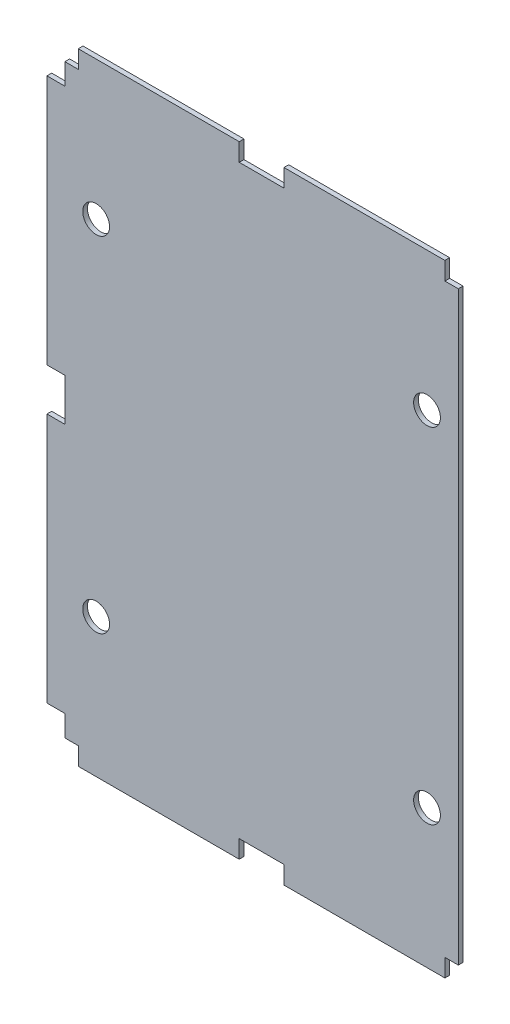
ISO-10303-21;
HEADER;
FILE_DESCRIPTION(('STEP AP214'),'2;1');
FILE_NAME('part.step','',(''),(''),'','','');
FILE_SCHEMA(('AUTOMOTIVE_DESIGN { 1 0 10303 214 1 1 1 1 }'));
ENDSEC;
DATA;
#1=APPLICATION_CONTEXT('core data for automotive mechanical design processes');
#2=APPLICATION_PROTOCOL_DEFINITION('international standard','automotive_design',2000,#1);
#3=PRODUCT_CONTEXT('',#1,'mechanical');
#4=PRODUCT('Part','Part','',(#3));
#5=PRODUCT_RELATED_PRODUCT_CATEGORY('part','',(#4));
#6=PRODUCT_DEFINITION_FORMATION('','',#4);
#7=PRODUCT_DEFINITION_CONTEXT('part definition',#1,'design');
#8=PRODUCT_DEFINITION('design','',#6,#7);
#9=PRODUCT_DEFINITION_SHAPE('','',#8);
#10=(LENGTH_UNIT() NAMED_UNIT(*) SI_UNIT(.MILLI.,.METRE.));
#11=(NAMED_UNIT(*) PLANE_ANGLE_UNIT() SI_UNIT($,.RADIAN.));
#12=(NAMED_UNIT(*) SI_UNIT($,.STERADIAN.) SOLID_ANGLE_UNIT());
#13=UNCERTAINTY_MEASURE_WITH_UNIT(LENGTH_MEASURE(1.E-05),#10,'distance_accuracy_value','');
#14=(GEOMETRIC_REPRESENTATION_CONTEXT(3) GLOBAL_UNCERTAINTY_ASSIGNED_CONTEXT((#13)) GLOBAL_UNIT_ASSIGNED_CONTEXT((#10,
#11,#12)) REPRESENTATION_CONTEXT('',''));
#15=CARTESIAN_POINT('',(0.,0.,0.));
#16=DIRECTION('',(0.,0.,1.));
#17=DIRECTION('',(1.,0.,0.));
#18=AXIS2_PLACEMENT_3D('',#15,#16,#17);
#19=CARTESIAN_POINT('',(0.,-207.9625,3.3528));
#20=DIRECTION('',(0.,1.,0.));
#21=DIRECTION('',(0.,0.,1.));
#22=AXIS2_PLACEMENT_3D('',#19,#20,#21);
#23=PLANE('',#22);
#24=DIRECTION('',(1.,0.,0.));
#25=VECTOR('',#24,1.);
#26=CARTESIAN_POINT('',(0.,-207.9625,0.));
#27=LINE('',#26,#25);
#28=CARTESIAN_POINT('',(-139.7,-207.9625,0.));
#29=VERTEX_POINT('',#28);
#30=CARTESIAN_POINT('',(-130.175,-207.9625,0.));
#31=VERTEX_POINT('',#30);
#32=EDGE_CURVE('E269',#29,#31,#27,.T.);
#33=ORIENTED_EDGE('',*,*,#32,.T.);
#34=DIRECTION('',(0.,0.,-1.));
#35=VECTOR('',#34,1.);
#36=CARTESIAN_POINT('',(-130.175,-207.9625,3.3528));
#37=LINE('',#36,#35);
#38=CARTESIAN_POINT('',(-130.175,-207.9625,3.3528));
#39=VERTEX_POINT('',#38);
#40=EDGE_CURVE('E11',#39,#31,#37,.T.);
#41=ORIENTED_EDGE('',*,*,#40,.F.);
#42=DIRECTION('',(1.,0.,0.));
#43=VECTOR('',#42,1.);
#44=CARTESIAN_POINT('',(0.,-207.9625,3.3528));
#45=LINE('',#44,#43);
#46=CARTESIAN_POINT('',(-139.7,-207.9625,3.3528));
#47=VERTEX_POINT('',#46);
#48=EDGE_CURVE('E414',#47,#39,#45,.T.);
#49=ORIENTED_EDGE('',*,*,#48,.F.);
#50=DIRECTION('',(0.,0.,-1.));
#51=VECTOR('',#50,1.);
#52=CARTESIAN_POINT('',(-139.7,-207.9625,3.3528));
#53=LINE('',#52,#51);
#54=EDGE_CURVE('E52',#47,#29,#53,.T.);
#55=ORIENTED_EDGE('',*,*,#54,.T.);
#56=EDGE_LOOP('',(#33,#41,#49,#55));
#57=FACE_BOUND('',#56,.T.);
#58=ADVANCED_FACE('F35',(#57),#23,.F.);
#59=CARTESIAN_POINT('',(-130.175,0.,3.3528));
#60=DIRECTION('',(1.,0.,0.));
#61=DIRECTION('',(0.,0.,-1.));
#62=AXIS2_PLACEMENT_3D('',#59,#60,#61);
#63=PLANE('',#62);
#64=DIRECTION('',(0.,-1.,0.));
#65=VECTOR('',#64,1.);
#66=CARTESIAN_POINT('',(-130.175,0.,0.));
#67=LINE('',#66,#65);
#68=CARTESIAN_POINT('',(-130.175,-220.6625,0.));
#69=VERTEX_POINT('',#68);
#70=EDGE_CURVE('E271',#31,#69,#67,.T.);
#71=ORIENTED_EDGE('',*,*,#70,.T.);
#72=DIRECTION('',(0.,0.,-1.));
#73=VECTOR('',#72,1.);
#74=CARTESIAN_POINT('',(-130.175,-220.6625,3.3528));
#75=LINE('',#74,#73);
#76=CARTESIAN_POINT('',(-130.175,-220.6625,3.3528));
#77=VERTEX_POINT('',#76);
#78=EDGE_CURVE('E44',#77,#69,#75,.T.);
#79=ORIENTED_EDGE('',*,*,#78,.F.);
#80=DIRECTION('',(0.,-1.,0.));
#81=VECTOR('',#80,1.);
#82=CARTESIAN_POINT('',(-130.175,0.,3.3528));
#83=LINE('',#82,#81);
#84=EDGE_CURVE('E150',#39,#77,#83,.T.);
#85=ORIENTED_EDGE('',*,*,#84,.F.);
#86=ORIENTED_EDGE('',*,*,#40,.T.);
#87=EDGE_LOOP('',(#71,#79,#85,#86));
#88=FACE_BOUND('',#87,.T.);
#89=ADVANCED_FACE('F397',(#88),#63,.F.);
#90=CARTESIAN_POINT('',(0.,-220.6625,3.3528));
#91=DIRECTION('',(0.,-1.,0.));
#92=DIRECTION('',(1.,0.,0.));
#93=AXIS2_PLACEMENT_3D('',#90,#91,#92);
#94=PLANE('',#93);
#95=DIRECTION('',(-1.,0.,0.));
#96=VECTOR('',#95,1.);
#97=CARTESIAN_POINT('',(0.,-220.6625,0.));
#98=LINE('',#97,#96);
#99=CARTESIAN_POINT('',(-15.875,-220.6625,0.));
#100=VERTEX_POINT('',#99);
#101=EDGE_CURVE('E276',#100,#69,#98,.T.);
#102=ORIENTED_EDGE('',*,*,#101,.F.);
#103=DIRECTION('',(0.,0.,-1.));
#104=VECTOR('',#103,1.);
#105=CARTESIAN_POINT('',(-15.875,-220.6625,3.3528));
#106=LINE('',#105,#104);
#107=CARTESIAN_POINT('',(-15.875,-220.6625,3.3528));
#108=VERTEX_POINT('',#107);
#109=EDGE_CURVE('E390',#108,#100,#106,.T.);
#110=ORIENTED_EDGE('',*,*,#109,.F.);
#111=DIRECTION('',(-1.,0.,0.));
#112=VECTOR('',#111,1.);
#113=CARTESIAN_POINT('',(0.,-220.6625,3.3528));
#114=LINE('',#113,#112);
#115=EDGE_CURVE('E396',#108,#77,#114,.T.);
#116=ORIENTED_EDGE('',*,*,#115,.T.);
#117=ORIENTED_EDGE('',*,*,#78,.T.);
#118=EDGE_LOOP('',(#102,#110,#116,#117));
#119=FACE_BOUND('',#118,.T.);
#120=ADVANCED_FACE('F394',(#119),#94,.T.);
#121=CARTESIAN_POINT('',(-15.8750000000001,0.,3.3528));
#122=DIRECTION('',(1.,0.,0.));
#123=DIRECTION('',(0.,1.,0.));
#124=AXIS2_PLACEMENT_3D('',#121,#122,#123);
#125=PLANE('',#124);
#126=DIRECTION('',(0.,-1.,0.));
#127=VECTOR('',#126,1.);
#128=CARTESIAN_POINT('',(-15.8750000000001,0.,0.));
#129=LINE('',#128,#127);
#130=CARTESIAN_POINT('',(-15.875,-207.9625,0.));
#131=VERTEX_POINT('',#130);
#132=EDGE_CURVE('E279',#131,#100,#129,.T.);
#133=ORIENTED_EDGE('',*,*,#132,.F.);
#134=DIRECTION('',(0.,0.,-1.));
#135=VECTOR('',#134,1.);
#136=CARTESIAN_POINT('',(-15.875,-207.9625,3.3528));
#137=LINE('',#136,#135);
#138=CARTESIAN_POINT('',(-15.875,-207.9625,3.3528));
#139=VERTEX_POINT('',#138);
#140=EDGE_CURVE('E388',#139,#131,#137,.T.);
#141=ORIENTED_EDGE('',*,*,#140,.F.);
#142=DIRECTION('',(0.,-1.,0.));
#143=VECTOR('',#142,1.);
#144=CARTESIAN_POINT('',(-15.8750000000001,0.,3.3528));
#145=LINE('',#144,#143);
#146=EDGE_CURVE('E410',#139,#108,#145,.T.);
#147=ORIENTED_EDGE('',*,*,#146,.T.);
#148=ORIENTED_EDGE('',*,*,#109,.T.);
#149=EDGE_LOOP('',(#133,#141,#147,#148));
#150=FACE_BOUND('',#149,.T.);
#151=ADVANCED_FACE('F406',(#150),#125,.T.);
#152=CARTESIAN_POINT('',(15.8750000000005,-207.9625,0.));
#153=VERTEX_POINT('',#152);
#154=EDGE_CURVE('E273',#131,#153,#27,.T.);
#155=ORIENTED_EDGE('',*,*,#154,.T.);
#156=DIRECTION('',(0.,0.,-1.));
#157=VECTOR('',#156,1.);
#158=CARTESIAN_POINT('',(15.8750000000005,-207.9625,3.3528));
#159=LINE('',#158,#157);
#160=CARTESIAN_POINT('',(15.8750000000005,-207.9625,3.3528));
#161=VERTEX_POINT('',#160);
#162=EDGE_CURVE('E385',#161,#153,#159,.T.);
#163=ORIENTED_EDGE('',*,*,#162,.F.);
#164=EDGE_CURVE('E412',#139,#161,#45,.T.);
#165=ORIENTED_EDGE('',*,*,#164,.F.);
#166=ORIENTED_EDGE('',*,*,#140,.T.);
#167=EDGE_LOOP('',(#155,#163,#165,#166));
#168=FACE_BOUND('',#167,.T.);
#169=ADVANCED_FACE('F493',(#168),#23,.F.);
#170=CARTESIAN_POINT('',(15.8750000000005,0.,3.3528));
#171=DIRECTION('',(1.,0.,0.));
#172=DIRECTION('',(0.,0.,-1.));
#173=AXIS2_PLACEMENT_3D('',#170,#171,#172);
#174=PLANE('',#173);
#175=DIRECTION('',(0.,-1.,0.));
#176=VECTOR('',#175,1.);
#177=CARTESIAN_POINT('',(15.8750000000005,0.,0.));
#178=LINE('',#177,#176);
#179=CARTESIAN_POINT('',(15.8750000000005,-220.6625,0.));
#180=VERTEX_POINT('',#179);
#181=EDGE_CURVE('E282',#153,#180,#178,.T.);
#182=ORIENTED_EDGE('',*,*,#181,.T.);
#183=DIRECTION('',(0.,0.,-1.));
#184=VECTOR('',#183,1.);
#185=CARTESIAN_POINT('',(15.8750000000005,-220.6625,3.3528));
#186=LINE('',#185,#184);
#187=CARTESIAN_POINT('',(15.8750000000005,-220.6625,3.3528));
#188=VERTEX_POINT('',#187);
#189=EDGE_CURVE('E383',#188,#180,#186,.T.);
#190=ORIENTED_EDGE('',*,*,#189,.F.);
#191=DIRECTION('',(0.,-1.,0.));
#192=VECTOR('',#191,1.);
#193=CARTESIAN_POINT('',(15.8750000000005,0.,3.3528));
#194=LINE('',#193,#192);
#195=EDGE_CURVE('E418',#161,#188,#194,.T.);
#196=ORIENTED_EDGE('',*,*,#195,.F.);
#197=ORIENTED_EDGE('',*,*,#162,.T.);
#198=EDGE_LOOP('',(#182,#190,#196,#197));
#199=FACE_BOUND('',#198,.T.);
#200=ADVANCED_FACE('F502',(#199),#174,.F.);
#201=CARTESIAN_POINT('',(0.,-220.6625,3.3528));
#202=DIRECTION('',(0.,-1.,0.));
#203=DIRECTION('',(1.,0.,0.));
#204=AXIS2_PLACEMENT_3D('',#201,#202,#203);
#205=PLANE('',#204);
#206=DIRECTION('',(-1.,0.,0.));
#207=VECTOR('',#206,1.);
#208=CARTESIAN_POINT('',(0.,-220.6625,0.));
#209=LINE('',#208,#207);
#210=CARTESIAN_POINT('',(130.175,-220.6625,0.));
#211=VERTEX_POINT('',#210);
#212=EDGE_CURVE('E285',#211,#180,#209,.T.);
#213=ORIENTED_EDGE('',*,*,#212,.F.);
#214=DIRECTION('',(0.,0.,-1.));
#215=VECTOR('',#214,1.);
#216=CARTESIAN_POINT('',(130.175,-220.6625,3.3528));
#217=LINE('',#216,#215);
#218=CARTESIAN_POINT('',(130.175,-220.6625,3.3528));
#219=VERTEX_POINT('',#218);
#220=EDGE_CURVE('E381',#219,#211,#217,.T.);
#221=ORIENTED_EDGE('',*,*,#220,.F.);
#222=DIRECTION('',(-1.,0.,0.));
#223=VECTOR('',#222,1.);
#224=CARTESIAN_POINT('',(0.,-220.6625,3.3528));
#225=LINE('',#224,#223);
#226=EDGE_CURVE('E420',#219,#188,#225,.T.);
#227=ORIENTED_EDGE('',*,*,#226,.T.);
#228=ORIENTED_EDGE('',*,*,#189,.T.);
#229=EDGE_LOOP('',(#213,#221,#227,#228));
#230=FACE_BOUND('',#229,.T.);
#231=ADVANCED_FACE('F514',(#230),#205,.T.);
#232=CARTESIAN_POINT('',(130.175,0.,3.3528));
#233=DIRECTION('',(1.,0.,0.));
#234=DIRECTION('',(0.,0.,-1.));
#235=AXIS2_PLACEMENT_3D('',#232,#233,#234);
#236=PLANE('',#235);
#237=DIRECTION('',(0.,-1.,0.));
#238=VECTOR('',#237,1.);
#239=CARTESIAN_POINT('',(130.175,0.,0.));
#240=LINE('',#239,#238);
#241=CARTESIAN_POINT('',(130.175,-207.9625,0.));
#242=VERTEX_POINT('',#241);
#243=EDGE_CURVE('E288',#242,#211,#240,.T.);
#244=ORIENTED_EDGE('',*,*,#243,.F.);
#245=DIRECTION('',(0.,0.,-1.));
#246=VECTOR('',#245,1.);
#247=CARTESIAN_POINT('',(130.175,-207.9625,3.3528));
#248=LINE('',#247,#246);
#249=CARTESIAN_POINT('',(130.175,-207.9625,3.3528));
#250=VERTEX_POINT('',#249);
#251=EDGE_CURVE('E379',#250,#242,#248,.T.);
#252=ORIENTED_EDGE('',*,*,#251,.F.);
#253=DIRECTION('',(0.,-1.,0.));
#254=VECTOR('',#253,1.);
#255=CARTESIAN_POINT('',(130.175,0.,3.3528));
#256=LINE('',#255,#254);
#257=EDGE_CURVE('E423',#250,#219,#256,.T.);
#258=ORIENTED_EDGE('',*,*,#257,.T.);
#259=ORIENTED_EDGE('',*,*,#220,.T.);
#260=EDGE_LOOP('',(#244,#252,#258,#259));
#261=FACE_BOUND('',#260,.T.);
#262=ADVANCED_FACE('F506',(#261),#236,.T.);
#263=CARTESIAN_POINT('',(139.7,-207.9625,0.));
#264=VERTEX_POINT('',#263);
#265=EDGE_CURVE('E272',#242,#264,#27,.T.);
#266=ORIENTED_EDGE('',*,*,#265,.T.);
#267=DIRECTION('',(0.,0.,-1.));
#268=VECTOR('',#267,1.);
#269=CARTESIAN_POINT('',(139.7,-207.9625,3.3528));
#270=LINE('',#269,#268);
#271=CARTESIAN_POINT('',(139.7,-207.9625,3.3528));
#272=VERTEX_POINT('',#271);
#273=EDGE_CURVE('E376',#272,#264,#270,.T.);
#274=ORIENTED_EDGE('',*,*,#273,.F.);
#275=EDGE_CURVE('E426',#250,#272,#45,.T.);
#276=ORIENTED_EDGE('',*,*,#275,.F.);
#277=ORIENTED_EDGE('',*,*,#251,.T.);
#278=EDGE_LOOP('',(#266,#274,#276,#277));
#279=FACE_BOUND('',#278,.T.);
#280=ADVANCED_FACE('F494',(#279),#23,.F.);
#281=CARTESIAN_POINT('',(139.7,0.,3.3528));
#282=DIRECTION('',(-1.,0.,0.));
#283=DIRECTION('',(0.,0.,1.));
#284=AXIS2_PLACEMENT_3D('',#281,#282,#283);
#285=PLANE('',#284);
#286=DIRECTION('',(0.,1.,0.));
#287=VECTOR('',#286,1.);
#288=CARTESIAN_POINT('',(139.7,0.,0.));
#289=LINE('',#288,#287);
#290=CARTESIAN_POINT('',(139.7,207.9625,0.));
#291=VERTEX_POINT('',#290);
#292=EDGE_CURVE('E291',#264,#291,#289,.T.);
#293=ORIENTED_EDGE('',*,*,#292,.T.);
#294=DIRECTION('',(0.,0.,-1.));
#295=VECTOR('',#294,1.);
#296=CARTESIAN_POINT('',(139.7,207.9625,3.3528));
#297=LINE('',#296,#295);
#298=CARTESIAN_POINT('',(139.7,207.9625,3.3528));
#299=VERTEX_POINT('',#298);
#300=EDGE_CURVE('E374',#299,#291,#297,.T.);
#301=ORIENTED_EDGE('',*,*,#300,.F.);
#302=DIRECTION('',(0.,1.,0.));
#303=VECTOR('',#302,1.);
#304=CARTESIAN_POINT('',(139.7,0.,3.3528));
#305=LINE('',#304,#303);
#306=EDGE_CURVE('E427',#272,#299,#305,.T.);
#307=ORIENTED_EDGE('',*,*,#306,.F.);
#308=ORIENTED_EDGE('',*,*,#273,.T.);
#309=EDGE_LOOP('',(#293,#301,#307,#308));
#310=FACE_BOUND('',#309,.T.);
#311=ADVANCED_FACE('F505',(#310),#285,.F.);
#312=CARTESIAN_POINT('',(0.,207.9625,3.3528));
#313=DIRECTION('',(0.,1.,0.));
#314=DIRECTION('',(0.,0.,1.));
#315=AXIS2_PLACEMENT_3D('',#312,#313,#314);
#316=PLANE('',#315);
#317=DIRECTION('',(1.,0.,0.));
#318=VECTOR('',#317,1.);
#319=CARTESIAN_POINT('',(0.,207.9625,0.));
#320=LINE('',#319,#318);
#321=CARTESIAN_POINT('',(130.175,207.9625,0.));
#322=VERTEX_POINT('',#321);
#323=EDGE_CURVE('E294',#322,#291,#320,.T.);
#324=ORIENTED_EDGE('',*,*,#323,.F.);
#325=DIRECTION('',(0.,0.,-1.));
#326=VECTOR('',#325,1.);
#327=CARTESIAN_POINT('',(130.175,207.9625,3.3528));
#328=LINE('',#327,#326);
#329=CARTESIAN_POINT('',(130.175,207.9625,3.3528));
#330=VERTEX_POINT('',#329);
#331=EDGE_CURVE('E372',#330,#322,#328,.T.);
#332=ORIENTED_EDGE('',*,*,#331,.F.);
#333=DIRECTION('',(1.,0.,0.));
#334=VECTOR('',#333,1.);
#335=CARTESIAN_POINT('',(0.,207.9625,3.3528));
#336=LINE('',#335,#334);
#337=EDGE_CURVE('E429',#330,#299,#336,.T.);
#338=ORIENTED_EDGE('',*,*,#337,.T.);
#339=ORIENTED_EDGE('',*,*,#300,.T.);
#340=EDGE_LOOP('',(#324,#332,#338,#339));
#341=FACE_BOUND('',#340,.T.);
#342=ADVANCED_FACE('F512',(#341),#316,.T.);
#343=CARTESIAN_POINT('',(130.175,0.,3.3528));
#344=DIRECTION('',(-1.,0.,0.));
#345=DIRECTION('',(0.,0.,1.));
#346=AXIS2_PLACEMENT_3D('',#343,#344,#345);
#347=PLANE('',#346);
#348=DIRECTION('',(0.,1.,0.));
#349=VECTOR('',#348,1.);
#350=CARTESIAN_POINT('',(130.175,0.,0.));
#351=LINE('',#350,#349);
#352=CARTESIAN_POINT('',(130.175,220.6625,0.));
#353=VERTEX_POINT('',#352);
#354=EDGE_CURVE('E297',#322,#353,#351,.T.);
#355=ORIENTED_EDGE('',*,*,#354,.T.);
#356=DIRECTION('',(0.,0.,-1.));
#357=VECTOR('',#356,1.);
#358=CARTESIAN_POINT('',(130.175,220.6625,3.3528));
#359=LINE('',#358,#357);
#360=CARTESIAN_POINT('',(130.175,220.6625,3.3528));
#361=VERTEX_POINT('',#360);
#362=EDGE_CURVE('E370',#361,#353,#359,.T.);
#363=ORIENTED_EDGE('',*,*,#362,.F.);
#364=DIRECTION('',(0.,1.,0.));
#365=VECTOR('',#364,1.);
#366=CARTESIAN_POINT('',(130.175,0.,3.3528));
#367=LINE('',#366,#365);
#368=EDGE_CURVE('E432',#330,#361,#367,.T.);
#369=ORIENTED_EDGE('',*,*,#368,.F.);
#370=ORIENTED_EDGE('',*,*,#331,.T.);
#371=EDGE_LOOP('',(#355,#363,#369,#370));
#372=FACE_BOUND('',#371,.T.);
#373=ADVANCED_FACE('F776',(#372),#347,.F.);
#374=CARTESIAN_POINT('',(0.,220.6625,3.3528));
#375=DIRECTION('',(0.,1.,0.));
#376=DIRECTION('',(0.,0.,1.));
#377=AXIS2_PLACEMENT_3D('',#374,#375,#376);
#378=PLANE('',#377);
#379=DIRECTION('',(1.,0.,0.));
#380=VECTOR('',#379,1.);
#381=CARTESIAN_POINT('',(0.,220.6625,0.));
#382=LINE('',#381,#380);
#383=CARTESIAN_POINT('',(15.8750000000001,220.6625,0.));
#384=VERTEX_POINT('',#383);
#385=EDGE_CURVE('E302',#384,#353,#382,.T.);
#386=ORIENTED_EDGE('',*,*,#385,.F.);
#387=DIRECTION('',(0.,0.,-1.));
#388=VECTOR('',#387,1.);
#389=CARTESIAN_POINT('',(15.8750000000001,220.6625,3.3528));
#390=LINE('',#389,#388);
#391=CARTESIAN_POINT('',(15.8750000000001,220.6625,3.3528));
#392=VERTEX_POINT('',#391);
#393=EDGE_CURVE('E368',#392,#384,#390,.T.);
#394=ORIENTED_EDGE('',*,*,#393,.F.);
#395=DIRECTION('',(1.,0.,0.));
#396=VECTOR('',#395,1.);
#397=CARTESIAN_POINT('',(0.,220.6625,3.3528));
#398=LINE('',#397,#396);
#399=EDGE_CURVE('E436',#392,#361,#398,.T.);
#400=ORIENTED_EDGE('',*,*,#399,.T.);
#401=ORIENTED_EDGE('',*,*,#362,.T.);
#402=EDGE_LOOP('',(#386,#394,#400,#401));
#403=FACE_BOUND('',#402,.T.);
#404=ADVANCED_FACE('F765',(#403),#378,.T.);
#405=CARTESIAN_POINT('',(15.8750000000001,0.,3.3528));
#406=DIRECTION('',(-1.,0.,0.));
#407=DIRECTION('',(0.,0.,1.));
#408=AXIS2_PLACEMENT_3D('',#405,#406,#407);
#409=PLANE('',#408);
#410=DIRECTION('',(0.,1.,0.));
#411=VECTOR('',#410,1.);
#412=CARTESIAN_POINT('',(15.8750000000001,0.,0.));
#413=LINE('',#412,#411);
#414=CARTESIAN_POINT('',(15.8750000000001,207.9625,0.));
#415=VERTEX_POINT('',#414);
#416=EDGE_CURVE('E305',#415,#384,#413,.T.);
#417=ORIENTED_EDGE('',*,*,#416,.F.);
#418=DIRECTION('',(0.,0.,-1.));
#419=VECTOR('',#418,1.);
#420=CARTESIAN_POINT('',(15.8750000000001,207.9625,3.3528));
#421=LINE('',#420,#419);
#422=CARTESIAN_POINT('',(15.8750000000001,207.9625,3.3528));
#423=VERTEX_POINT('',#422);
#424=EDGE_CURVE('E366',#423,#415,#421,.T.);
#425=ORIENTED_EDGE('',*,*,#424,.F.);
#426=DIRECTION('',(0.,1.,0.));
#427=VECTOR('',#426,1.);
#428=CARTESIAN_POINT('',(15.8750000000001,0.,3.3528));
#429=LINE('',#428,#427);
#430=EDGE_CURVE('E439',#423,#392,#429,.T.);
#431=ORIENTED_EDGE('',*,*,#430,.T.);
#432=ORIENTED_EDGE('',*,*,#393,.T.);
#433=EDGE_LOOP('',(#417,#425,#431,#432));
#434=FACE_BOUND('',#433,.T.);
#435=ADVANCED_FACE('F755',(#434),#409,.T.);
#436=CARTESIAN_POINT('',(-15.875,207.9625,0.));
#437=VERTEX_POINT('',#436);
#438=EDGE_CURVE('E299',#437,#415,#320,.T.);
#439=ORIENTED_EDGE('',*,*,#438,.F.);
#440=DIRECTION('',(0.,0.,-1.));
#441=VECTOR('',#440,1.);
#442=CARTESIAN_POINT('',(-15.875,207.9625,3.3528));
#443=LINE('',#442,#441);
#444=CARTESIAN_POINT('',(-15.875,207.9625,3.3528));
#445=VERTEX_POINT('',#444);
#446=EDGE_CURVE('E364',#445,#437,#443,.T.);
#447=ORIENTED_EDGE('',*,*,#446,.F.);
#448=EDGE_CURVE('E434',#445,#423,#336,.T.);
#449=ORIENTED_EDGE('',*,*,#448,.T.);
#450=ORIENTED_EDGE('',*,*,#424,.T.);
#451=EDGE_LOOP('',(#439,#447,#449,#450));
#452=FACE_BOUND('',#451,.T.);
#453=ADVANCED_FACE('F715',(#452),#316,.T.);
#454=CARTESIAN_POINT('',(-15.875,0.,3.3528));
#455=DIRECTION('',(-1.,0.,0.));
#456=DIRECTION('',(0.,0.,1.));
#457=AXIS2_PLACEMENT_3D('',#454,#455,#456);
#458=PLANE('',#457);
#459=DIRECTION('',(0.,1.,0.));
#460=VECTOR('',#459,1.);
#461=CARTESIAN_POINT('',(-15.875,0.,0.));
#462=LINE('',#461,#460);
#463=CARTESIAN_POINT('',(-15.875,220.6625,0.));
#464=VERTEX_POINT('',#463);
#465=EDGE_CURVE('E308',#437,#464,#462,.T.);
#466=ORIENTED_EDGE('',*,*,#465,.T.);
#467=DIRECTION('',(0.,0.,-1.));
#468=VECTOR('',#467,1.);
#469=CARTESIAN_POINT('',(-15.875,220.6625,3.3528));
#470=LINE('',#469,#468);
#471=CARTESIAN_POINT('',(-15.875,220.6625,3.3528));
#472=VERTEX_POINT('',#471);
#473=EDGE_CURVE('E362',#472,#464,#470,.T.);
#474=ORIENTED_EDGE('',*,*,#473,.F.);
#475=DIRECTION('',(0.,1.,0.));
#476=VECTOR('',#475,1.);
#477=CARTESIAN_POINT('',(-15.875,0.,3.3528));
#478=LINE('',#477,#476);
#479=EDGE_CURVE('E442',#445,#472,#478,.T.);
#480=ORIENTED_EDGE('',*,*,#479,.F.);
#481=ORIENTED_EDGE('',*,*,#446,.T.);
#482=EDGE_LOOP('',(#466,#474,#480,#481));
#483=FACE_BOUND('',#482,.T.);
#484=ADVANCED_FACE('F736',(#483),#458,.F.);
#485=CARTESIAN_POINT('',(0.,220.6625,3.3528));
#486=DIRECTION('',(0.,1.,0.));
#487=DIRECTION('',(0.,0.,1.));
#488=AXIS2_PLACEMENT_3D('',#485,#486,#487);
#489=PLANE('',#488);
#490=DIRECTION('',(1.,0.,0.));
#491=VECTOR('',#490,1.);
#492=CARTESIAN_POINT('',(0.,220.6625,0.));
#493=LINE('',#492,#491);
#494=CARTESIAN_POINT('',(-130.175,220.6625,0.));
#495=VERTEX_POINT('',#494);
#496=EDGE_CURVE('E311',#495,#464,#493,.T.);
#497=ORIENTED_EDGE('',*,*,#496,.F.);
#498=DIRECTION('',(0.,0.,-1.));
#499=VECTOR('',#498,1.);
#500=CARTESIAN_POINT('',(-130.175,220.6625,3.3528));
#501=LINE('',#500,#499);
#502=CARTESIAN_POINT('',(-130.175,220.6625,3.3528));
#503=VERTEX_POINT('',#502);
#504=EDGE_CURVE('E360',#503,#495,#501,.T.);
#505=ORIENTED_EDGE('',*,*,#504,.F.);
#506=DIRECTION('',(1.,0.,0.));
#507=VECTOR('',#506,1.);
#508=CARTESIAN_POINT('',(0.,220.6625,3.3528));
#509=LINE('',#508,#507);
#510=EDGE_CURVE('E444',#503,#472,#509,.T.);
#511=ORIENTED_EDGE('',*,*,#510,.T.);
#512=ORIENTED_EDGE('',*,*,#473,.T.);
#513=EDGE_LOOP('',(#497,#505,#511,#512));
#514=FACE_BOUND('',#513,.T.);
#515=ADVANCED_FACE('F725',(#514),#489,.T.);
#516=CARTESIAN_POINT('',(-130.175,0.,3.3528));
#517=DIRECTION('',(-1.,0.,0.));
#518=DIRECTION('',(0.,0.,1.));
#519=AXIS2_PLACEMENT_3D('',#516,#517,#518);
#520=PLANE('',#519);
#521=DIRECTION('',(0.,1.,0.));
#522=VECTOR('',#521,1.);
#523=CARTESIAN_POINT('',(-130.175,0.,0.));
#524=LINE('',#523,#522);
#525=CARTESIAN_POINT('',(-130.175,207.9625,0.));
#526=VERTEX_POINT('',#525);
#527=EDGE_CURVE('E314',#526,#495,#524,.T.);
#528=ORIENTED_EDGE('',*,*,#527,.F.);
#529=DIRECTION('',(0.,0.,-1.));
#530=VECTOR('',#529,1.);
#531=CARTESIAN_POINT('',(-130.175,207.9625,3.3528));
#532=LINE('',#531,#530);
#533=CARTESIAN_POINT('',(-130.175,207.9625,3.3528));
#534=VERTEX_POINT('',#533);
#535=EDGE_CURVE('E358',#534,#526,#532,.T.);
#536=ORIENTED_EDGE('',*,*,#535,.F.);
#537=DIRECTION('',(0.,1.,0.));
#538=VECTOR('',#537,1.);
#539=CARTESIAN_POINT('',(-130.175,0.,3.3528));
#540=LINE('',#539,#538);
#541=EDGE_CURVE('E447',#534,#503,#540,.T.);
#542=ORIENTED_EDGE('',*,*,#541,.T.);
#543=ORIENTED_EDGE('',*,*,#504,.T.);
#544=EDGE_LOOP('',(#528,#536,#542,#543));
#545=FACE_BOUND('',#544,.T.);
#546=ADVANCED_FACE('F712',(#545),#520,.T.);
#547=CARTESIAN_POINT('',(-139.7,207.9625,0.));
#548=VERTEX_POINT('',#547);
#549=EDGE_CURVE('E298',#548,#526,#320,.T.);
#550=ORIENTED_EDGE('',*,*,#549,.F.);
#551=DIRECTION('',(0.,0.,-1.));
#552=VECTOR('',#551,1.);
#553=CARTESIAN_POINT('',(-139.7,207.9625,3.3528));
#554=LINE('',#553,#552);
#555=CARTESIAN_POINT('',(-139.7,207.9625,3.3528));
#556=VERTEX_POINT('',#555);
#557=EDGE_CURVE('E356',#556,#548,#554,.T.);
#558=ORIENTED_EDGE('',*,*,#557,.F.);
#559=EDGE_CURVE('E433',#556,#534,#336,.T.);
#560=ORIENTED_EDGE('',*,*,#559,.T.);
#561=ORIENTED_EDGE('',*,*,#535,.T.);
#562=EDGE_LOOP('',(#550,#558,#560,#561));
#563=FACE_BOUND('',#562,.T.);
#564=ADVANCED_FACE('F487',(#563),#316,.T.);
#565=CARTESIAN_POINT('',(-139.7,0.,3.3528));
#566=DIRECTION('',(-1.,0.,0.));
#567=DIRECTION('',(0.,0.,1.));
#568=AXIS2_PLACEMENT_3D('',#565,#566,#567);
#569=PLANE('',#568);
#570=DIRECTION('',(0.,1.,0.));
#571=VECTOR('',#570,1.);
#572=CARTESIAN_POINT('',(-139.7,0.,0.));
#573=LINE('',#572,#571);
#574=CARTESIAN_POINT('',(-139.7,192.88125,0.));
#575=VERTEX_POINT('',#574);
#576=EDGE_CURVE('E317',#575,#548,#573,.T.);
#577=ORIENTED_EDGE('',*,*,#576,.F.);
#578=DIRECTION('',(0.,0.,-1.));
#579=VECTOR('',#578,1.);
#580=CARTESIAN_POINT('',(-139.7,192.88125,3.3528));
#581=LINE('',#580,#579);
#582=CARTESIAN_POINT('',(-139.7,192.88125,3.3528));
#583=VERTEX_POINT('',#582);
#584=EDGE_CURVE('E354',#583,#575,#581,.T.);
#585=ORIENTED_EDGE('',*,*,#584,.F.);
#586=DIRECTION('',(0.,1.,0.));
#587=VECTOR('',#586,1.);
#588=CARTESIAN_POINT('',(-139.7,0.,3.3528));
#589=LINE('',#588,#587);
#590=EDGE_CURVE('E255',#583,#556,#589,.T.);
#591=ORIENTED_EDGE('',*,*,#590,.T.);
#592=ORIENTED_EDGE('',*,*,#557,.T.);
#593=EDGE_LOOP('',(#577,#585,#591,#592));
#594=FACE_BOUND('',#593,.T.);
#595=ADVANCED_FACE('F476',(#594),#569,.T.);
#596=CARTESIAN_POINT('',(0.,192.88125,3.3528));
#597=DIRECTION('',(0.,-1.,0.));
#598=DIRECTION('',(0.,0.,-1.));
#599=AXIS2_PLACEMENT_3D('',#596,#597,#598);
#600=PLANE('',#599);
#601=DIRECTION('',(-1.,0.,0.));
#602=VECTOR('',#601,1.);
#603=CARTESIAN_POINT('',(0.,192.88125,0.));
#604=LINE('',#603,#602);
#605=CARTESIAN_POINT('',(-152.4,192.88125,0.));
#606=VERTEX_POINT('',#605);
#607=EDGE_CURVE('E320',#575,#606,#604,.T.);
#608=ORIENTED_EDGE('',*,*,#607,.T.);
#609=DIRECTION('',(0.,0.,-1.));
#610=VECTOR('',#609,1.);
#611=CARTESIAN_POINT('',(-152.4,192.88125,3.3528));
#612=LINE('',#611,#610);
#613=CARTESIAN_POINT('',(-152.4,192.88125,3.3528));
#614=VERTEX_POINT('',#613);
#615=EDGE_CURVE('E351',#614,#606,#612,.T.);
#616=ORIENTED_EDGE('',*,*,#615,.F.);
#617=DIRECTION('',(-1.,0.,0.));
#618=VECTOR('',#617,1.);
#619=CARTESIAN_POINT('',(0.,192.88125,3.3528));
#620=LINE('',#619,#618);
#621=EDGE_CURVE('E451',#583,#614,#620,.T.);
#622=ORIENTED_EDGE('',*,*,#621,.F.);
#623=ORIENTED_EDGE('',*,*,#584,.T.);
#624=EDGE_LOOP('',(#608,#616,#622,#623));
#625=FACE_BOUND('',#624,.T.);
#626=ADVANCED_FACE('F486',(#625),#600,.F.);
#627=CARTESIAN_POINT('',(-152.4,0.,3.3528));
#628=DIRECTION('',(1.,0.,0.));
#629=DIRECTION('',(0.,1.,0.));
#630=AXIS2_PLACEMENT_3D('',#627,#628,#629);
#631=PLANE('',#630);
#632=DIRECTION('',(0.,-1.,0.));
#633=VECTOR('',#632,1.);
#634=CARTESIAN_POINT('',(-152.4,0.,0.));
#635=LINE('',#634,#633);
#636=CARTESIAN_POINT('',(-152.4,15.08125,0.));
#637=VERTEX_POINT('',#636);
#638=EDGE_CURVE('E324',#606,#637,#635,.T.);
#639=ORIENTED_EDGE('',*,*,#638,.T.);
#640=DIRECTION('',(0.,0.,-1.));
#641=VECTOR('',#640,1.);
#642=CARTESIAN_POINT('',(-152.4,15.08125,3.3528));
#643=LINE('',#642,#641);
#644=CARTESIAN_POINT('',(-152.4,15.08125,3.3528));
#645=VERTEX_POINT('',#644);
#646=EDGE_CURVE('E349',#645,#637,#643,.T.);
#647=ORIENTED_EDGE('',*,*,#646,.F.);
#648=DIRECTION('',(0.,-1.,0.));
#649=VECTOR('',#648,1.);
#650=CARTESIAN_POINT('',(-152.4,0.,3.3528));
#651=LINE('',#650,#649);
#652=EDGE_CURVE('E453',#614,#645,#651,.T.);
#653=ORIENTED_EDGE('',*,*,#652,.F.);
#654=ORIENTED_EDGE('',*,*,#615,.T.);
#655=EDGE_LOOP('',(#639,#647,#653,#654));
#656=FACE_BOUND('',#655,.T.);
#657=ADVANCED_FACE('F677',(#656),#631,.F.);
#658=CARTESIAN_POINT('',(0.,15.08125,3.3528));
#659=DIRECTION('',(0.,-1.,0.));
#660=DIRECTION('',(1.,0.,0.));
#661=AXIS2_PLACEMENT_3D('',#658,#659,#660);
#662=PLANE('',#661);
#663=DIRECTION('',(-1.,0.,0.));
#664=VECTOR('',#663,1.);
#665=CARTESIAN_POINT('',(0.,15.08125,0.));
#666=LINE('',#665,#664);
#667=CARTESIAN_POINT('',(-139.7,15.08125,0.));
#668=VERTEX_POINT('',#667);
#669=EDGE_CURVE('E327',#668,#637,#666,.T.);
#670=ORIENTED_EDGE('',*,*,#669,.F.);
#671=DIRECTION('',(0.,0.,-1.));
#672=VECTOR('',#671,1.);
#673=CARTESIAN_POINT('',(-139.7,15.08125,3.3528));
#674=LINE('',#673,#672);
#675=CARTESIAN_POINT('',(-139.7,15.08125,3.3528));
#676=VERTEX_POINT('',#675);
#677=EDGE_CURVE('E347',#676,#668,#674,.T.);
#678=ORIENTED_EDGE('',*,*,#677,.F.);
#679=DIRECTION('',(-1.,0.,0.));
#680=VECTOR('',#679,1.);
#681=CARTESIAN_POINT('',(0.,15.08125,3.3528));
#682=LINE('',#681,#680);
#683=EDGE_CURVE('E455',#676,#645,#682,.T.);
#684=ORIENTED_EDGE('',*,*,#683,.T.);
#685=ORIENTED_EDGE('',*,*,#646,.T.);
#686=EDGE_LOOP('',(#670,#678,#684,#685));
#687=FACE_BOUND('',#686,.T.);
#688=ADVANCED_FACE('F466',(#687),#662,.T.);
#689=CARTESIAN_POINT('',(-139.7,-15.08125,0.));
#690=VERTEX_POINT('',#689);
#691=EDGE_CURVE('E322',#690,#668,#573,.T.);
#692=ORIENTED_EDGE('',*,*,#691,.F.);
#693=DIRECTION('',(0.,0.,-1.));
#694=VECTOR('',#693,1.);
#695=CARTESIAN_POINT('',(-139.7,-15.08125,3.3528));
#696=LINE('',#695,#694);
#697=CARTESIAN_POINT('',(-139.7,-15.08125,3.3528));
#698=VERTEX_POINT('',#697);
#699=EDGE_CURVE('E345',#698,#690,#696,.T.);
#700=ORIENTED_EDGE('',*,*,#699,.F.);
#701=EDGE_CURVE('E254',#698,#676,#589,.T.);
#702=ORIENTED_EDGE('',*,*,#701,.T.);
#703=ORIENTED_EDGE('',*,*,#677,.T.);
#704=EDGE_LOOP('',(#692,#700,#702,#703));
#705=FACE_BOUND('',#704,.T.);
#706=ADVANCED_FACE('F460',(#705),#569,.T.);
#707=CARTESIAN_POINT('',(0.,-15.08125,3.3528));
#708=DIRECTION('',(0.,-1.,0.));
#709=DIRECTION('',(1.,0.,0.));
#710=AXIS2_PLACEMENT_3D('',#707,#708,#709);
#711=PLANE('',#710);
#712=DIRECTION('',(-1.,0.,0.));
#713=VECTOR('',#712,1.);
#714=CARTESIAN_POINT('',(0.,-15.08125,0.));
#715=LINE('',#714,#713);
#716=CARTESIAN_POINT('',(-152.4,-15.08125,0.));
#717=VERTEX_POINT('',#716);
#718=EDGE_CURVE('E330',#690,#717,#715,.T.);
#719=ORIENTED_EDGE('',*,*,#718,.T.);
#720=DIRECTION('',(0.,0.,-1.));
#721=VECTOR('',#720,1.);
#722=CARTESIAN_POINT('',(-152.4,-15.08125,3.3528));
#723=LINE('',#722,#721);
#724=CARTESIAN_POINT('',(-152.4,-15.08125,3.3528));
#725=VERTEX_POINT('',#724);
#726=EDGE_CURVE('E247',#725,#717,#723,.T.);
#727=ORIENTED_EDGE('',*,*,#726,.F.);
#728=DIRECTION('',(-1.,0.,0.));
#729=VECTOR('',#728,1.);
#730=CARTESIAN_POINT('',(0.,-15.08125,3.3528));
#731=LINE('',#730,#729);
#732=EDGE_CURVE('E235',#698,#725,#731,.T.);
#733=ORIENTED_EDGE('',*,*,#732,.F.);
#734=ORIENTED_EDGE('',*,*,#699,.T.);
#735=EDGE_LOOP('',(#719,#727,#733,#734));
#736=FACE_BOUND('',#735,.T.);
#737=ADVANCED_FACE('F490',(#736),#711,.F.);
#738=CARTESIAN_POINT('',(-152.4,0.,3.3528));
#739=DIRECTION('',(1.,0.,0.));
#740=DIRECTION('',(0.,1.,0.));
#741=AXIS2_PLACEMENT_3D('',#738,#739,#740);
#742=PLANE('',#741);
#743=DIRECTION('',(0.,-1.,0.));
#744=VECTOR('',#743,1.);
#745=CARTESIAN_POINT('',(-152.4,0.,0.));
#746=LINE('',#745,#744);
#747=CARTESIAN_POINT('',(-152.4,-192.88125,0.));
#748=VERTEX_POINT('',#747);
#749=EDGE_CURVE('E244',#717,#748,#746,.T.);
#750=ORIENTED_EDGE('',*,*,#749,.T.);
#751=DIRECTION('',(0.,0.,-1.));
#752=VECTOR('',#751,1.);
#753=CARTESIAN_POINT('',(-152.4,-192.88125,3.3528));
#754=LINE('',#753,#752);
#755=CARTESIAN_POINT('',(-152.4,-192.88125,3.3528));
#756=VERTEX_POINT('',#755);
#757=EDGE_CURVE('E241',#756,#748,#754,.T.);
#758=ORIENTED_EDGE('',*,*,#757,.F.);
#759=DIRECTION('',(0.,-1.,0.));
#760=VECTOR('',#759,1.);
#761=CARTESIAN_POINT('',(-152.4,0.,3.3528));
#762=LINE('',#761,#760);
#763=EDGE_CURVE('E226',#725,#756,#762,.T.);
#764=ORIENTED_EDGE('',*,*,#763,.F.);
#765=ORIENTED_EDGE('',*,*,#726,.T.);
#766=EDGE_LOOP('',(#750,#758,#764,#765));
#767=FACE_BOUND('',#766,.T.);
#768=ADVANCED_FACE('F242',(#767),#742,.F.);
#769=CARTESIAN_POINT('',(0.,-192.88125,3.3528));
#770=DIRECTION('',(0.,-1.,0.));
#771=DIRECTION('',(0.,0.,-1.));
#772=AXIS2_PLACEMENT_3D('',#769,#770,#771);
#773=PLANE('',#772);
#774=DIRECTION('',(-1.,0.,0.));
#775=VECTOR('',#774,1.);
#776=CARTESIAN_POINT('',(0.,-192.88125,0.));
#777=LINE('',#776,#775);
#778=CARTESIAN_POINT('',(-139.7,-192.88125,0.));
#779=VERTEX_POINT('',#778);
#780=EDGE_CURVE('E333',#779,#748,#777,.T.);
#781=ORIENTED_EDGE('',*,*,#780,.F.);
#782=DIRECTION('',(0.,0.,-1.));
#783=VECTOR('',#782,1.);
#784=CARTESIAN_POINT('',(-139.7,-192.88125,3.3528));
#785=LINE('',#784,#783);
#786=CARTESIAN_POINT('',(-139.7,-192.88125,3.3528));
#787=VERTEX_POINT('',#786);
#788=EDGE_CURVE('E138',#787,#779,#785,.T.);
#789=ORIENTED_EDGE('',*,*,#788,.F.);
#790=DIRECTION('',(-1.,0.,0.));
#791=VECTOR('',#790,1.);
#792=CARTESIAN_POINT('',(0.,-192.88125,3.3528));
#793=LINE('',#792,#791);
#794=EDGE_CURVE('E232',#787,#756,#793,.T.);
#795=ORIENTED_EDGE('',*,*,#794,.T.);
#796=ORIENTED_EDGE('',*,*,#757,.T.);
#797=EDGE_LOOP('',(#781,#789,#795,#796));
#798=FACE_BOUND('',#797,.T.);
#799=ADVANCED_FACE('F249',(#798),#773,.T.);
#800=CARTESIAN_POINT('',(-117.475,-122.2375,3.3528));
#801=DIRECTION('',(0.,0.,-1.));
#802=DIRECTION('',(-1.,0.,0.));
#803=AXIS2_PLACEMENT_3D('',#800,#801,#802);
#804=CYLINDRICAL_SURFACE('',#803,9.52500000000002);
#805=CARTESIAN_POINT('',(-117.475,-122.2375,3.3528));
#806=DIRECTION('',(0.,0.,1.));
#807=DIRECTION('',(1.,0.,0.));
#808=AXIS2_PLACEMENT_3D('',#805,#806,#807);
#809=CIRCLE('',#808,9.52500000000002);
#810=CARTESIAN_POINT('',(-107.95,-122.2375,3.3528));
#811=VERTEX_POINT('',#810);
#812=EDGE_CURVE('E252',#811,#811,#809,.T.);
#813=ORIENTED_EDGE('',*,*,#812,.T.);
#814=EDGE_LOOP('',(#813));
#815=FACE_BOUND('',#814,.T.);
#816=CARTESIAN_POINT('',(-117.475,-122.2375,0.));
#817=DIRECTION('',(0.,0.,1.));
#818=DIRECTION('',(1.,0.,0.));
#819=AXIS2_PLACEMENT_3D('',#816,#817,#818);
#820=CIRCLE('',#819,9.52500000000002);
#821=CARTESIAN_POINT('',(-107.95,-122.2375,0.));
#822=VERTEX_POINT('',#821);
#823=EDGE_CURVE('E335',#822,#822,#820,.T.);
#824=ORIENTED_EDGE('',*,*,#823,.F.);
#825=EDGE_LOOP('',(#824));
#826=FACE_BOUND('',#825,.T.);
#827=ADVANCED_FACE('F474',(#815,#826),#804,.F.);
#828=EDGE_CURVE('E321',#29,#779,#573,.T.);
#829=ORIENTED_EDGE('',*,*,#828,.F.);
#830=ORIENTED_EDGE('',*,*,#54,.F.);
#831=EDGE_CURVE('E250',#47,#787,#589,.T.);
#832=ORIENTED_EDGE('',*,*,#831,.T.);
#833=ORIENTED_EDGE('',*,*,#788,.T.);
#834=EDGE_LOOP('',(#829,#830,#832,#833));
#835=FACE_BOUND('',#834,.T.);
#836=ADVANCED_FACE('F471',(#835),#569,.T.);
#837=CARTESIAN_POINT('',(117.475,122.2375,3.3528));
#838=DIRECTION('',(0.,0.,-1.));
#839=DIRECTION('',(-1.,0.,0.));
#840=AXIS2_PLACEMENT_3D('',#837,#838,#839);
#841=CYLINDRICAL_SURFACE('',#840,9.52499999999999);
#842=CARTESIAN_POINT('',(117.475,122.2375,3.3528));
#843=DIRECTION('',(0.,0.,1.));
#844=DIRECTION('',(1.,0.,0.));
#845=AXIS2_PLACEMENT_3D('',#842,#843,#844);
#846=CIRCLE('',#845,9.52499999999999);
#847=CARTESIAN_POINT('',(127.,122.2375,3.3528));
#848=VERTEX_POINT('',#847);
#849=EDGE_CURVE('E533',#848,#848,#846,.T.);
#850=ORIENTED_EDGE('',*,*,#849,.T.);
#851=EDGE_LOOP('',(#850));
#852=FACE_BOUND('',#851,.T.);
#853=CARTESIAN_POINT('',(117.475,122.2375,0.));
#854=DIRECTION('',(0.,0.,1.));
#855=DIRECTION('',(1.,0.,0.));
#856=AXIS2_PLACEMENT_3D('',#853,#854,#855);
#857=CIRCLE('',#856,9.52499999999999);
#858=CARTESIAN_POINT('',(127.,122.2375,0.));
#859=VERTEX_POINT('',#858);
#860=EDGE_CURVE('E266',#859,#859,#857,.T.);
#861=ORIENTED_EDGE('',*,*,#860,.F.);
#862=EDGE_LOOP('',(#861));
#863=FACE_BOUND('',#862,.T.);
#864=ADVANCED_FACE('F473',(#852,#863),#841,.F.);
#865=CARTESIAN_POINT('',(117.475,-122.2375,3.3528));
#866=DIRECTION('',(0.,0.,-1.));
#867=DIRECTION('',(-1.,0.,0.));
#868=AXIS2_PLACEMENT_3D('',#865,#866,#867);
#869=CYLINDRICAL_SURFACE('',#868,9.525);
#870=CARTESIAN_POINT('',(117.475,-122.2375,3.3528));
#871=DIRECTION('',(0.,0.,1.));
#872=DIRECTION('',(1.,0.,0.));
#873=AXIS2_PLACEMENT_3D('',#870,#871,#872);
#874=CIRCLE('',#873,9.525);
#875=CARTESIAN_POINT('',(127.,-122.2375,3.3528));
#876=VERTEX_POINT('',#875);
#877=EDGE_CURVE('E341',#876,#876,#874,.F.);
#878=ORIENTED_EDGE('',*,*,#877,.F.);
#879=EDGE_LOOP('',(#878));
#880=FACE_BOUND('',#879,.T.);
#881=CARTESIAN_POINT('',(117.475,-122.2375,0.));
#882=DIRECTION('',(0.,0.,1.));
#883=DIRECTION('',(1.,0.,0.));
#884=AXIS2_PLACEMENT_3D('',#881,#882,#883);
#885=CIRCLE('',#884,9.525);
#886=CARTESIAN_POINT('',(127.,-122.2375,0.));
#887=VERTEX_POINT('',#886);
#888=EDGE_CURVE('E263',#887,#887,#885,.F.);
#889=ORIENTED_EDGE('',*,*,#888,.T.);
#890=EDGE_LOOP('',(#889));
#891=FACE_BOUND('',#890,.T.);
#892=ADVANCED_FACE('F37',(#880,#891),#869,.F.);
#893=CARTESIAN_POINT('',(-117.475,122.2375,3.3528));
#894=DIRECTION('',(0.,0.,-1.));
#895=DIRECTION('',(-1.,0.,0.));
#896=AXIS2_PLACEMENT_3D('',#893,#894,#895);
#897=CYLINDRICAL_SURFACE('',#896,9.52499999999996);
#898=CARTESIAN_POINT('',(-117.475,122.2375,3.3528));
#899=DIRECTION('',(0.,0.,1.));
#900=DIRECTION('',(1.,0.,0.));
#901=AXIS2_PLACEMENT_3D('',#898,#899,#900);
#902=CIRCLE('',#901,9.52499999999996);
#903=CARTESIAN_POINT('',(-107.95,122.2375,3.3528));
#904=VERTEX_POINT('',#903);
#905=EDGE_CURVE('E260',#904,#904,#902,.F.);
#906=ORIENTED_EDGE('',*,*,#905,.F.);
#907=EDGE_LOOP('',(#906));
#908=FACE_BOUND('',#907,.T.);
#909=CARTESIAN_POINT('',(-117.475,122.2375,0.));
#910=DIRECTION('',(0.,0.,1.));
#911=DIRECTION('',(1.,0.,0.));
#912=AXIS2_PLACEMENT_3D('',#909,#910,#911);
#913=CIRCLE('',#912,9.52499999999996);
#914=CARTESIAN_POINT('',(-107.95,122.2375,0.));
#915=VERTEX_POINT('',#914);
#916=EDGE_CURVE('E338',#915,#915,#913,.F.);
#917=ORIENTED_EDGE('',*,*,#916,.T.);
#918=EDGE_LOOP('',(#917));
#919=FACE_BOUND('',#918,.T.);
#920=ADVANCED_FACE('F544',(#908,#919),#897,.F.);
#921=CARTESIAN_POINT('',(0.,0.,3.3528));
#922=DIRECTION('',(0.,0.,1.));
#923=DIRECTION('',(1.,0.,0.));
#924=AXIS2_PLACEMENT_3D('',#921,#922,#923);
#925=PLANE('',#924);
#926=ORIENTED_EDGE('',*,*,#877,.T.);
#927=EDGE_LOOP('',(#926));
#928=FACE_BOUND('',#927,.T.);
#929=ORIENTED_EDGE('',*,*,#849,.F.);
#930=EDGE_LOOP('',(#929));
#931=FACE_BOUND('',#930,.T.);
#932=ORIENTED_EDGE('',*,*,#48,.T.);
#933=ORIENTED_EDGE('',*,*,#84,.T.);
#934=ORIENTED_EDGE('',*,*,#115,.F.);
#935=ORIENTED_EDGE('',*,*,#146,.F.);
#936=ORIENTED_EDGE('',*,*,#164,.T.);
#937=ORIENTED_EDGE('',*,*,#195,.T.);
#938=ORIENTED_EDGE('',*,*,#226,.F.);
#939=ORIENTED_EDGE('',*,*,#257,.F.);
#940=ORIENTED_EDGE('',*,*,#275,.T.);
#941=ORIENTED_EDGE('',*,*,#306,.T.);
#942=ORIENTED_EDGE('',*,*,#337,.F.);
#943=ORIENTED_EDGE('',*,*,#368,.T.);
#944=ORIENTED_EDGE('',*,*,#399,.F.);
#945=ORIENTED_EDGE('',*,*,#430,.F.);
#946=ORIENTED_EDGE('',*,*,#448,.F.);
#947=ORIENTED_EDGE('',*,*,#479,.T.);
#948=ORIENTED_EDGE('',*,*,#510,.F.);
#949=ORIENTED_EDGE('',*,*,#541,.F.);
#950=ORIENTED_EDGE('',*,*,#559,.F.);
#951=ORIENTED_EDGE('',*,*,#590,.F.);
#952=ORIENTED_EDGE('',*,*,#621,.T.);
#953=ORIENTED_EDGE('',*,*,#652,.T.);
#954=ORIENTED_EDGE('',*,*,#683,.F.);
#955=ORIENTED_EDGE('',*,*,#701,.F.);
#956=ORIENTED_EDGE('',*,*,#732,.T.);
#957=ORIENTED_EDGE('',*,*,#763,.T.);
#958=ORIENTED_EDGE('',*,*,#794,.F.);
#959=ORIENTED_EDGE('',*,*,#831,.F.);
#960=EDGE_LOOP('',(#932,#933,#934,#935,#936,#937,#938,#939,#940,#941,#942,#943,#944,#945,#946,
#947,#948,#949,#950,#951,#952,#953,#954,#955,#956,#957,#958,#959));
#961=FACE_BOUND('',#960,.T.);
#962=ORIENTED_EDGE('',*,*,#812,.F.);
#963=EDGE_LOOP('',(#962));
#964=FACE_BOUND('',#963,.T.);
#965=ORIENTED_EDGE('',*,*,#905,.T.);
#966=EDGE_LOOP('',(#965));
#967=FACE_BOUND('',#966,.T.);
#968=ADVANCED_FACE('F228',(#928,#931,#961,#964,#967),#925,.T.);
#969=CARTESIAN_POINT('',(0.,0.,0.));
#970=DIRECTION('',(0.,0.,1.));
#971=DIRECTION('',(1.,0.,0.));
#972=AXIS2_PLACEMENT_3D('',#969,#970,#971);
#973=PLANE('',#972);
#974=ORIENTED_EDGE('',*,*,#888,.F.);
#975=EDGE_LOOP('',(#974));
#976=FACE_BOUND('',#975,.T.);
#977=ORIENTED_EDGE('',*,*,#860,.T.);
#978=EDGE_LOOP('',(#977));
#979=FACE_BOUND('',#978,.T.);
#980=ORIENTED_EDGE('',*,*,#32,.F.);
#981=ORIENTED_EDGE('',*,*,#828,.T.);
#982=ORIENTED_EDGE('',*,*,#780,.T.);
#983=ORIENTED_EDGE('',*,*,#749,.F.);
#984=ORIENTED_EDGE('',*,*,#718,.F.);
#985=ORIENTED_EDGE('',*,*,#691,.T.);
#986=ORIENTED_EDGE('',*,*,#669,.T.);
#987=ORIENTED_EDGE('',*,*,#638,.F.);
#988=ORIENTED_EDGE('',*,*,#607,.F.);
#989=ORIENTED_EDGE('',*,*,#576,.T.);
#990=ORIENTED_EDGE('',*,*,#549,.T.);
#991=ORIENTED_EDGE('',*,*,#527,.T.);
#992=ORIENTED_EDGE('',*,*,#496,.T.);
#993=ORIENTED_EDGE('',*,*,#465,.F.);
#994=ORIENTED_EDGE('',*,*,#438,.T.);
#995=ORIENTED_EDGE('',*,*,#416,.T.);
#996=ORIENTED_EDGE('',*,*,#385,.T.);
#997=ORIENTED_EDGE('',*,*,#354,.F.);
#998=ORIENTED_EDGE('',*,*,#323,.T.);
#999=ORIENTED_EDGE('',*,*,#292,.F.);
#1000=ORIENTED_EDGE('',*,*,#265,.F.);
#1001=ORIENTED_EDGE('',*,*,#243,.T.);
#1002=ORIENTED_EDGE('',*,*,#212,.T.);
#1003=ORIENTED_EDGE('',*,*,#181,.F.);
#1004=ORIENTED_EDGE('',*,*,#154,.F.);
#1005=ORIENTED_EDGE('',*,*,#132,.T.);
#1006=ORIENTED_EDGE('',*,*,#101,.T.);
#1007=ORIENTED_EDGE('',*,*,#70,.F.);
#1008=EDGE_LOOP('',(#980,#981,#982,#983,#984,#985,#986,#987,#988,#989,#990,#991,#992,#993,#994,
#995,#996,#997,#998,#999,#1000,#1001,#1002,#1003,#1004,#1005,#1006,#1007));
#1009=FACE_BOUND('',#1008,.T.);
#1010=ORIENTED_EDGE('',*,*,#823,.T.);
#1011=EDGE_LOOP('',(#1010));
#1012=FACE_BOUND('',#1011,.T.);
#1013=ORIENTED_EDGE('',*,*,#916,.F.);
#1014=EDGE_LOOP('',(#1013));
#1015=FACE_BOUND('',#1014,.T.);
#1016=ADVANCED_FACE('F400',(#976,#979,#1009,#1012,#1015),#973,.F.);
#1017=CLOSED_SHELL('',(#58,#89,#120,#151,#169,#200,#231,#262,#280,#311,#342,#373,#404,#435,#453,
#484,#515,#546,#564,#595,#626,#657,#688,#706,#737,#768,#799,#827,#836,#864,#892,#920,#968,#1016));
#1018=MANIFOLD_SOLID_BREP('B2',#1017);
#1019=ADVANCED_BREP_SHAPE_REPRESENTATION('',(#18,#1018),#14);
#1020=SHAPE_DEFINITION_REPRESENTATION(#9,#1019);
ENDSEC;
END-ISO-10303-21;
